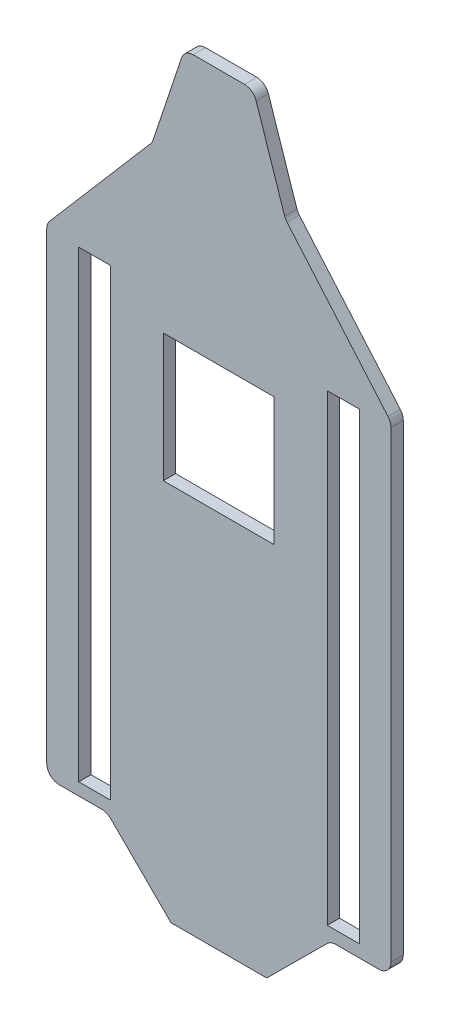
ISO-10303-21;
HEADER;
FILE_DESCRIPTION(('STEP AP214'),'2;1');
FILE_NAME('part.step','',(''),(''),'','','');
FILE_SCHEMA(('AUTOMOTIVE_DESIGN { 1 0 10303 214 1 1 1 1 }'));
ENDSEC;
DATA;
#1=APPLICATION_CONTEXT('core data for automotive mechanical design processes');
#2=APPLICATION_PROTOCOL_DEFINITION('international standard','automotive_design',2000,#1);
#3=PRODUCT_CONTEXT('',#1,'mechanical');
#4=PRODUCT('Part','Part','',(#3));
#5=PRODUCT_RELATED_PRODUCT_CATEGORY('part','',(#4));
#6=PRODUCT_DEFINITION_FORMATION('','',#4);
#7=PRODUCT_DEFINITION_CONTEXT('part definition',#1,'design');
#8=PRODUCT_DEFINITION('design','',#6,#7);
#9=PRODUCT_DEFINITION_SHAPE('','',#8);
#10=(LENGTH_UNIT() NAMED_UNIT(*) SI_UNIT(.MILLI.,.METRE.));
#11=(NAMED_UNIT(*) PLANE_ANGLE_UNIT() SI_UNIT($,.RADIAN.));
#12=(NAMED_UNIT(*) SI_UNIT($,.STERADIAN.) SOLID_ANGLE_UNIT());
#13=UNCERTAINTY_MEASURE_WITH_UNIT(LENGTH_MEASURE(1.E-05),#10,'distance_accuracy_value','');
#14=(GEOMETRIC_REPRESENTATION_CONTEXT(3) GLOBAL_UNCERTAINTY_ASSIGNED_CONTEXT((#13)) GLOBAL_UNIT_ASSIGNED_CONTEXT((#10,
#11,#12)) REPRESENTATION_CONTEXT('',''));
#15=CARTESIAN_POINT('',(0.,0.,0.));
#16=DIRECTION('',(0.,0.,1.));
#17=DIRECTION('',(1.,0.,0.));
#18=AXIS2_PLACEMENT_3D('',#15,#16,#17);
#19=CARTESIAN_POINT('',(22.4368378443237,20.8599431741363,5.));
#20=DIRECTION('',(0.,0.,-1.));
#21=DIRECTION('',(-1.,0.,0.));
#22=AXIS2_PLACEMENT_3D('',#19,#20,#21);
#23=PLANE('',#22);
#24=DIRECTION('',(0.,1.,0.));
#25=VECTOR('',#24,1.);
#26=CARTESIAN_POINT('',(127.,219.008918922933,5.));
#27=LINE('',#26,#25);
#28=CARTESIAN_POINT('',(127.,30.8599431741363,5.));
#29=VERTEX_POINT('',#28);
#30=CARTESIAN_POINT('',(127.,219.008918922933,5.));
#31=VERTEX_POINT('',#30);
#32=EDGE_CURVE('E294',#29,#31,#27,.T.);
#33=ORIENTED_EDGE('',*,*,#32,.F.);
#34=DIRECTION('',(1.,0.,0.));
#35=VECTOR('',#34,1.);
#36=CARTESIAN_POINT('',(127.,30.8599431741363,5.));
#37=LINE('',#36,#35);
#38=CARTESIAN_POINT('',(114.,30.8599431741363,5.));
#39=VERTEX_POINT('',#38);
#40=EDGE_CURVE('E302',#39,#29,#37,.T.);
#41=ORIENTED_EDGE('',*,*,#40,.F.);
#42=DIRECTION('',(0.,-1.,0.));
#43=VECTOR('',#42,1.);
#44=CARTESIAN_POINT('',(114.,30.8599431741363,5.));
#45=LINE('',#44,#43);
#46=CARTESIAN_POINT('',(114.,219.008918922933,5.));
#47=VERTEX_POINT('',#46);
#48=EDGE_CURVE('E299',#47,#39,#45,.T.);
#49=ORIENTED_EDGE('',*,*,#48,.F.);
#50=DIRECTION('',(-1.,0.,0.));
#51=VECTOR('',#50,1.);
#52=CARTESIAN_POINT('',(114.,219.008918922933,5.));
#53=LINE('',#52,#51);
#54=EDGE_CURVE('E296',#31,#47,#53,.T.);
#55=ORIENTED_EDGE('',*,*,#54,.F.);
#56=EDGE_LOOP('',(#33,#41,#49,#55));
#57=FACE_BOUND('',#56,.T.);
#58=DIRECTION('',(1.,0.,0.));
#59=VECTOR('',#58,1.);
#60=CARTESIAN_POINT('',(89.3828592898621,0.,5.));
#61=LINE('',#60,#59);
#62=CARTESIAN_POINT('',(50.5,0.,5.));
#63=VERTEX_POINT('',#62);
#64=CARTESIAN_POINT('',(89.3828592898621,0.,5.));
#65=VERTEX_POINT('',#64);
#66=EDGE_CURVE('E356',#63,#65,#61,.T.);
#67=ORIENTED_EDGE('',*,*,#66,.T.);
#68=DIRECTION('',(0.709013860793847,0.705194544223226,0.));
#69=VECTOR('',#68,1.);
#70=CARTESIAN_POINT('',(113.920048724422,24.4050124781055,5.));
#71=LINE('',#70,#69);
#72=CARTESIAN_POINT('',(113.920048724422,24.4050124781055,5.));
#73=VERTEX_POINT('',#72);
#74=EDGE_CURVE('E359',#65,#73,#71,.T.);
#75=ORIENTED_EDGE('',*,*,#74,.T.);
#76=CARTESIAN_POINT('',(117.446021445538,20.8599431741363,5.));
#77=DIRECTION('',(0.,0.,-1.));
#78=DIRECTION('',(1.,0.,0.));
#79=AXIS2_PLACEMENT_3D('',#76,#77,#78);
#80=CIRCLE('',#79,5.);
#81=CARTESIAN_POINT('',(117.446021445538,25.8599431741363,5.));
#82=VERTEX_POINT('',#81);
#83=EDGE_CURVE('E362',#73,#82,#80,.T.);
#84=ORIENTED_EDGE('',*,*,#83,.T.);
#85=DIRECTION('',(1.,0.,0.));
#86=VECTOR('',#85,1.);
#87=CARTESIAN_POINT('',(134.882859289862,25.8599431741363,5.));
#88=LINE('',#87,#86);
#89=CARTESIAN_POINT('',(134.882859289862,25.8599431741363,5.));
#90=VERTEX_POINT('',#89);
#91=EDGE_CURVE('E364',#82,#90,#88,.T.);
#92=ORIENTED_EDGE('',*,*,#91,.T.);
#93=CARTESIAN_POINT('',(134.882859289862,30.8599431741363,5.));
#94=DIRECTION('',(0.,0.,1.));
#95=DIRECTION('',(1.,0.,0.));
#96=AXIS2_PLACEMENT_3D('',#93,#94,#95);
#97=CIRCLE('',#96,5.);
#98=CARTESIAN_POINT('',(139.882859289862,30.8599431741363,5.));
#99=VERTEX_POINT('',#98);
#100=EDGE_CURVE('E366',#90,#99,#97,.T.);
#101=ORIENTED_EDGE('',*,*,#100,.T.);
#102=DIRECTION('',(0.,1.,0.));
#103=VECTOR('',#102,1.);
#104=CARTESIAN_POINT('',(139.882859289862,30.8599431741363,5.));
#105=LINE('',#104,#103);
#106=CARTESIAN_POINT('',(139.882859289862,219.008918922933,5.));
#107=VERTEX_POINT('',#106);
#108=EDGE_CURVE('E368',#99,#107,#105,.T.);
#109=ORIENTED_EDGE('',*,*,#108,.T.);
#110=CARTESIAN_POINT('',(134.882859289862,219.008918922933,5.));
#111=DIRECTION('',(0.,0.,1.));
#112=DIRECTION('',(1.,0.,0.));
#113=AXIS2_PLACEMENT_3D('',#110,#111,#112);
#114=CIRCLE('',#113,5.00000000000001);
#115=CARTESIAN_POINT('',(138.677534682009,222.264750409395,5.));
#116=VERTEX_POINT('',#115);
#117=EDGE_CURVE('E370',#107,#116,#114,.T.);
#118=ORIENTED_EDGE('',*,*,#117,.T.);
#119=DIRECTION('',(-0.651166297292376,0.758935078429333,0.));
#120=VECTOR('',#119,1.);
#121=CARTESIAN_POINT('',(97.621470018801,270.115641625254,5.));
#122=LINE('',#121,#120);
#123=CARTESIAN_POINT('',(97.621470018801,270.115641625254,5.));
#124=VERTEX_POINT('',#123);
#125=EDGE_CURVE('E372',#116,#124,#122,.T.);
#126=ORIENTED_EDGE('',*,*,#125,.T.);
#127=CARTESIAN_POINT('',(101.416145410948,273.371473111716,5.));
#128=DIRECTION('',(0.,0.,-1.));
#129=DIRECTION('',(-1.,0.,0.));
#130=AXIS2_PLACEMENT_3D('',#127,#128,#129);
#131=CIRCLE('',#130,4.99999999999998);
#132=CARTESIAN_POINT('',(96.6727289206954,271.790334281631,5.));
#133=VERTEX_POINT('',#132);
#134=EDGE_CURVE('E374',#124,#133,#131,.T.);
#135=ORIENTED_EDGE('',*,*,#134,.T.);
#136=DIRECTION('',(-0.316227766017022,0.948683298050452,0.));
#137=VECTOR('',#136,1.);
#138=CARTESIAN_POINT('',(85.0804626320662,306.567133147496,5.));
#139=LINE('',#138,#137);
#140=CARTESIAN_POINT('',(85.0804626320662,306.567133147496,5.));
#141=VERTEX_POINT('',#140);
#142=EDGE_CURVE('E376',#133,#141,#139,.T.);
#143=ORIENTED_EDGE('',*,*,#142,.T.);
#144=CARTESIAN_POINT('',(80.3370461418139,304.985994317411,5.));
#145=DIRECTION('',(0.,0.,1.));
#146=DIRECTION('',(1.,0.,0.));
#147=AXIS2_PLACEMENT_3D('',#144,#145,#146);
#148=CIRCLE('',#147,5.00000000000002);
#149=CARTESIAN_POINT('',(80.3789443517646,309.985818768329,5.));
#150=VERTEX_POINT('',#149);
#151=EDGE_CURVE('E378',#141,#150,#148,.T.);
#152=ORIENTED_EDGE('',*,*,#151,.T.);
#153=DIRECTION('',(-1.,0.,0.));
#154=VECTOR('',#153,1.);
#155=CARTESIAN_POINT('',(59.5039149380974,309.985818768329,5.));
#156=LINE('',#155,#154);
#157=CARTESIAN_POINT('',(59.5039149380974,309.985818768329,5.));
#158=VERTEX_POINT('',#157);
#159=EDGE_CURVE('E380',#150,#158,#156,.T.);
#160=ORIENTED_EDGE('',*,*,#159,.T.);
#161=CARTESIAN_POINT('',(59.545813148048,304.985994317411,5.));
#162=DIRECTION('',(0.,0.,1.));
#163=DIRECTION('',(-1.,0.,0.));
#164=AXIS2_PLACEMENT_3D('',#161,#162,#163);
#165=CIRCLE('',#164,5.00000000000002);
#166=CARTESIAN_POINT('',(54.8023966577958,306.567133147496,5.));
#167=VERTEX_POINT('',#166);
#168=EDGE_CURVE('E382',#158,#167,#165,.T.);
#169=ORIENTED_EDGE('',*,*,#168,.T.);
#170=DIRECTION('',(-0.316227766017022,-0.948683298050452,0.));
#171=VECTOR('',#170,1.);
#172=CARTESIAN_POINT('',(54.8023966577958,306.567133147496,5.));
#173=LINE('',#172,#171);
#174=CARTESIAN_POINT('',(43.2101303691666,271.790334281631,5.));
#175=VERTEX_POINT('',#174);
#176=EDGE_CURVE('E384',#167,#175,#173,.T.);
#177=ORIENTED_EDGE('',*,*,#176,.T.);
#178=CARTESIAN_POINT('',(38.4667138789144,273.371473111716,5.));
#179=DIRECTION('',(0.,0.,-1.));
#180=DIRECTION('',(1.,0.,0.));
#181=AXIS2_PLACEMENT_3D('',#178,#179,#180);
#182=CIRCLE('',#181,4.99999999999997);
#183=CARTESIAN_POINT('',(42.261389271061,270.115641625254,5.));
#184=VERTEX_POINT('',#183);
#185=EDGE_CURVE('E386',#175,#184,#182,.T.);
#186=ORIENTED_EDGE('',*,*,#185,.T.);
#187=DIRECTION('',(-0.651166297292376,-0.758935078429333,0.));
#188=VECTOR('',#187,1.);
#189=CARTESIAN_POINT('',(42.261389271061,270.115641625254,5.));
#190=LINE('',#189,#188);
#191=CARTESIAN_POINT('',(1.20532460785331,222.264750409395,5.));
#192=VERTEX_POINT('',#191);
#193=EDGE_CURVE('E388',#184,#192,#190,.T.);
#194=ORIENTED_EDGE('',*,*,#193,.T.);
#195=CARTESIAN_POINT('',(4.99999999999998,219.008918922933,5.));
#196=DIRECTION('',(0.,0.,1.));
#197=DIRECTION('',(-1.,0.,0.));
#198=AXIS2_PLACEMENT_3D('',#195,#196,#197);
#199=CIRCLE('',#198,5.00000000000001);
#200=CARTESIAN_POINT('',(0.,219.008918922933,5.));
#201=VERTEX_POINT('',#200);
#202=EDGE_CURVE('E390',#192,#201,#199,.T.);
#203=ORIENTED_EDGE('',*,*,#202,.T.);
#204=DIRECTION('',(0.,-1.,0.));
#205=VECTOR('',#204,1.);
#206=CARTESIAN_POINT('',(0.,30.8599431741363,5.));
#207=LINE('',#206,#205);
#208=CARTESIAN_POINT('',(0.,30.8599431741363,5.));
#209=VERTEX_POINT('',#208);
#210=EDGE_CURVE('E392',#201,#209,#207,.T.);
#211=ORIENTED_EDGE('',*,*,#210,.T.);
#212=CARTESIAN_POINT('',(5.00000000000002,30.8599431741363,5.));
#213=DIRECTION('',(0.,0.,1.));
#214=DIRECTION('',(-1.,0.,0.));
#215=AXIS2_PLACEMENT_3D('',#212,#213,#214);
#216=CIRCLE('',#215,5.);
#217=CARTESIAN_POINT('',(5.00000000000006,25.8599431741363,5.));
#218=VERTEX_POINT('',#217);
#219=EDGE_CURVE('E394',#209,#218,#216,.T.);
#220=ORIENTED_EDGE('',*,*,#219,.T.);
#221=DIRECTION('',(1.,0.,0.));
#222=VECTOR('',#221,1.);
#223=CARTESIAN_POINT('',(5.00000000000006,25.8599431741363,5.));
#224=LINE('',#223,#222);
#225=CARTESIAN_POINT('',(22.4368378443237,25.8599431741363,5.));
#226=VERTEX_POINT('',#225);
#227=EDGE_CURVE('E396',#218,#226,#224,.T.);
#228=ORIENTED_EDGE('',*,*,#227,.T.);
#229=CARTESIAN_POINT('',(22.4368378443237,20.8599431741363,5.));
#230=DIRECTION('',(0.,0.,-1.));
#231=DIRECTION('',(-1.,0.,0.));
#232=AXIS2_PLACEMENT_3D('',#229,#230,#231);
#233=CIRCLE('',#232,5.);
#234=CARTESIAN_POINT('',(25.9628105654398,24.4050124781055,5.));
#235=VERTEX_POINT('',#234);
#236=EDGE_CURVE('E398',#226,#235,#233,.T.);
#237=ORIENTED_EDGE('',*,*,#236,.T.);
#238=DIRECTION('',(0.709013860793847,-0.705194544223226,0.));
#239=VECTOR('',#238,1.);
#240=CARTESIAN_POINT('',(25.9628105654398,24.4050124781055,5.));
#241=LINE('',#240,#239);
#242=EDGE_CURVE('E400',#235,#63,#241,.T.);
#243=ORIENTED_EDGE('',*,*,#242,.T.);
#244=EDGE_LOOP('',(#67,#75,#84,#92,#101,#109,#118,#126,#135,#143,#152,#160,#169,#177,#186,#194,
#203,#211,#220,#228,#237,#243));
#245=FACE_BOUND('',#244,.T.);
#246=DIRECTION('',(1.,0.,0.));
#247=VECTOR('',#246,1.);
#248=CARTESIAN_POINT('',(13.,30.8599431741363,5.));
#249=LINE('',#248,#247);
#250=CARTESIAN_POINT('',(13.,30.8599431741363,5.));
#251=VERTEX_POINT('',#250);
#252=CARTESIAN_POINT('',(26.,30.8599431741363,5.));
#253=VERTEX_POINT('',#252);
#254=EDGE_CURVE('E325',#251,#253,#249,.T.);
#255=ORIENTED_EDGE('',*,*,#254,.F.);
#256=DIRECTION('',(0.,-1.,0.));
#257=VECTOR('',#256,1.);
#258=CARTESIAN_POINT('',(13.,219.008918922933,5.));
#259=LINE('',#258,#257);
#260=CARTESIAN_POINT('',(13.,219.008918922933,5.));
#261=VERTEX_POINT('',#260);
#262=EDGE_CURVE('E333',#261,#251,#259,.T.);
#263=ORIENTED_EDGE('',*,*,#262,.F.);
#264=DIRECTION('',(-1.,0.,0.));
#265=VECTOR('',#264,1.);
#266=CARTESIAN_POINT('',(26.,219.008918922933,5.));
#267=LINE('',#266,#265);
#268=CARTESIAN_POINT('',(26.,219.008918922933,5.));
#269=VERTEX_POINT('',#268);
#270=EDGE_CURVE('E330',#269,#261,#267,.T.);
#271=ORIENTED_EDGE('',*,*,#270,.F.);
#272=DIRECTION('',(0.,1.,0.));
#273=VECTOR('',#272,1.);
#274=CARTESIAN_POINT('',(26.,30.8599431741363,5.));
#275=LINE('',#274,#273);
#276=EDGE_CURVE('E327',#253,#269,#275,.T.);
#277=ORIENTED_EDGE('',*,*,#276,.F.);
#278=EDGE_LOOP('',(#255,#263,#271,#277));
#279=FACE_BOUND('',#278,.T.);
#280=DIRECTION('',(0.,-1.,0.));
#281=VECTOR('',#280,1.);
#282=CARTESIAN_POINT('',(92.382859289862,0.,5.));
#283=LINE('',#282,#281);
#284=CARTESIAN_POINT('',(92.382859289862,206.008918922933,5.));
#285=VERTEX_POINT('',#284);
#286=CARTESIAN_POINT('',(92.382859289862,154.008918922933,5.));
#287=VERTEX_POINT('',#286);
#288=EDGE_CURVE('E52',#285,#287,#283,.T.);
#289=ORIENTED_EDGE('',*,*,#288,.T.);
#290=DIRECTION('',(1.,0.,0.));
#291=VECTOR('',#290,1.);
#292=CARTESIAN_POINT('',(0.,154.008918922933,5.));
#293=LINE('',#292,#291);
#294=CARTESIAN_POINT('',(47.3828592898621,154.008918922933,5.));
#295=VERTEX_POINT('',#294);
#296=EDGE_CURVE('E275',#295,#287,#293,.T.);
#297=ORIENTED_EDGE('',*,*,#296,.F.);
#298=DIRECTION('',(0.,-1.,0.));
#299=VECTOR('',#298,1.);
#300=CARTESIAN_POINT('',(47.3828592898621,0.,5.));
#301=LINE('',#300,#299);
#302=CARTESIAN_POINT('',(47.382859289862,206.008918922933,5.));
#303=VERTEX_POINT('',#302);
#304=EDGE_CURVE('E278',#303,#295,#301,.T.);
#305=ORIENTED_EDGE('',*,*,#304,.F.);
#306=DIRECTION('',(-1.,0.,0.));
#307=VECTOR('',#306,1.);
#308=CARTESIAN_POINT('',(0.,206.008918922933,5.));
#309=LINE('',#308,#307);
#310=EDGE_CURVE('E284',#285,#303,#309,.T.);
#311=ORIENTED_EDGE('',*,*,#310,.F.);
#312=EDGE_LOOP('',(#289,#297,#305,#311));
#313=FACE_BOUND('',#312,.T.);
#314=ADVANCED_FACE('F37',(#57,#245,#279,#313),#23,.F.);
#315=CARTESIAN_POINT('',(22.4368378443237,20.8599431741363,0.));
#316=DIRECTION('',(0.,0.,-1.));
#317=DIRECTION('',(-1.,0.,0.));
#318=AXIS2_PLACEMENT_3D('',#315,#316,#317);
#319=PLANE('',#318);
#320=DIRECTION('',(1.,0.,0.));
#321=VECTOR('',#320,1.);
#322=CARTESIAN_POINT('',(89.3828592898621,0.,0.));
#323=LINE('',#322,#321);
#324=CARTESIAN_POINT('',(50.5,0.,0.));
#325=VERTEX_POINT('',#324);
#326=CARTESIAN_POINT('',(89.3828592898621,0.,0.));
#327=VERTEX_POINT('',#326);
#328=EDGE_CURVE('E355',#325,#327,#323,.T.);
#329=ORIENTED_EDGE('',*,*,#328,.F.);
#330=DIRECTION('',(0.709013860793847,-0.705194544223226,0.));
#331=VECTOR('',#330,1.);
#332=CARTESIAN_POINT('',(25.9628105654398,24.4050124781055,0.));
#333=LINE('',#332,#331);
#334=CARTESIAN_POINT('',(25.9628105654398,24.4050124781055,0.));
#335=VERTEX_POINT('',#334);
#336=EDGE_CURVE('E360',#335,#325,#333,.T.);
#337=ORIENTED_EDGE('',*,*,#336,.F.);
#338=CARTESIAN_POINT('',(22.4368378443237,20.8599431741363,0.));
#339=DIRECTION('',(0.,0.,-1.));
#340=DIRECTION('',(-1.,0.,0.));
#341=AXIS2_PLACEMENT_3D('',#338,#339,#340);
#342=CIRCLE('',#341,5.);
#343=CARTESIAN_POINT('',(22.4368378443237,25.8599431741363,0.));
#344=VERTEX_POINT('',#343);
#345=EDGE_CURVE('E443',#344,#335,#342,.T.);
#346=ORIENTED_EDGE('',*,*,#345,.F.);
#347=DIRECTION('',(1.,0.,0.));
#348=VECTOR('',#347,1.);
#349=CARTESIAN_POINT('',(5.00000000000006,25.8599431741363,0.));
#350=LINE('',#349,#348);
#351=CARTESIAN_POINT('',(5.00000000000006,25.8599431741363,0.));
#352=VERTEX_POINT('',#351);
#353=EDGE_CURVE('E441',#352,#344,#350,.T.);
#354=ORIENTED_EDGE('',*,*,#353,.F.);
#355=CARTESIAN_POINT('',(5.00000000000002,30.8599431741363,0.));
#356=DIRECTION('',(0.,0.,1.));
#357=DIRECTION('',(-1.,0.,0.));
#358=AXIS2_PLACEMENT_3D('',#355,#356,#357);
#359=CIRCLE('',#358,5.);
#360=CARTESIAN_POINT('',(0.,30.8599431741363,0.));
#361=VERTEX_POINT('',#360);
#362=EDGE_CURVE('E439',#361,#352,#359,.T.);
#363=ORIENTED_EDGE('',*,*,#362,.F.);
#364=DIRECTION('',(0.,-1.,0.));
#365=VECTOR('',#364,1.);
#366=CARTESIAN_POINT('',(0.,30.8599431741363,0.));
#367=LINE('',#366,#365);
#368=CARTESIAN_POINT('',(0.,219.008918922933,0.));
#369=VERTEX_POINT('',#368);
#370=EDGE_CURVE('E437',#369,#361,#367,.T.);
#371=ORIENTED_EDGE('',*,*,#370,.F.);
#372=CARTESIAN_POINT('',(4.99999999999998,219.008918922933,0.));
#373=DIRECTION('',(0.,0.,1.));
#374=DIRECTION('',(-1.,0.,0.));
#375=AXIS2_PLACEMENT_3D('',#372,#373,#374);
#376=CIRCLE('',#375,5.00000000000001);
#377=CARTESIAN_POINT('',(1.20532460785331,222.264750409395,0.));
#378=VERTEX_POINT('',#377);
#379=EDGE_CURVE('E435',#378,#369,#376,.T.);
#380=ORIENTED_EDGE('',*,*,#379,.F.);
#381=DIRECTION('',(-0.651166297292376,-0.758935078429333,0.));
#382=VECTOR('',#381,1.);
#383=CARTESIAN_POINT('',(42.261389271061,270.115641625254,0.));
#384=LINE('',#383,#382);
#385=CARTESIAN_POINT('',(42.261389271061,270.115641625254,0.));
#386=VERTEX_POINT('',#385);
#387=EDGE_CURVE('E433',#386,#378,#384,.T.);
#388=ORIENTED_EDGE('',*,*,#387,.F.);
#389=CARTESIAN_POINT('',(38.4667138789144,273.371473111716,0.));
#390=DIRECTION('',(0.,0.,-1.));
#391=DIRECTION('',(1.,0.,0.));
#392=AXIS2_PLACEMENT_3D('',#389,#390,#391);
#393=CIRCLE('',#392,4.99999999999997);
#394=CARTESIAN_POINT('',(43.2101303691666,271.790334281631,0.));
#395=VERTEX_POINT('',#394);
#396=EDGE_CURVE('E431',#395,#386,#393,.T.);
#397=ORIENTED_EDGE('',*,*,#396,.F.);
#398=DIRECTION('',(-0.316227766017022,-0.948683298050452,0.));
#399=VECTOR('',#398,1.);
#400=CARTESIAN_POINT('',(54.8023966577958,306.567133147496,0.));
#401=LINE('',#400,#399);
#402=CARTESIAN_POINT('',(54.8023966577958,306.567133147496,0.));
#403=VERTEX_POINT('',#402);
#404=EDGE_CURVE('E429',#403,#395,#401,.T.);
#405=ORIENTED_EDGE('',*,*,#404,.F.);
#406=CARTESIAN_POINT('',(59.545813148048,304.985994317411,0.));
#407=DIRECTION('',(0.,0.,1.));
#408=DIRECTION('',(-1.,0.,0.));
#409=AXIS2_PLACEMENT_3D('',#406,#407,#408);
#410=CIRCLE('',#409,5.00000000000002);
#411=CARTESIAN_POINT('',(59.5039149380974,309.985818768329,0.));
#412=VERTEX_POINT('',#411);
#413=EDGE_CURVE('E427',#412,#403,#410,.T.);
#414=ORIENTED_EDGE('',*,*,#413,.F.);
#415=DIRECTION('',(-1.,0.,0.));
#416=VECTOR('',#415,1.);
#417=CARTESIAN_POINT('',(59.5039149380974,309.985818768329,0.));
#418=LINE('',#417,#416);
#419=CARTESIAN_POINT('',(80.3789443517646,309.985818768329,0.));
#420=VERTEX_POINT('',#419);
#421=EDGE_CURVE('E425',#420,#412,#418,.T.);
#422=ORIENTED_EDGE('',*,*,#421,.F.);
#423=CARTESIAN_POINT('',(80.3370461418139,304.985994317411,0.));
#424=DIRECTION('',(0.,0.,1.));
#425=DIRECTION('',(1.,0.,0.));
#426=AXIS2_PLACEMENT_3D('',#423,#424,#425);
#427=CIRCLE('',#426,5.00000000000002);
#428=CARTESIAN_POINT('',(85.0804626320662,306.567133147496,0.));
#429=VERTEX_POINT('',#428);
#430=EDGE_CURVE('E423',#429,#420,#427,.T.);
#431=ORIENTED_EDGE('',*,*,#430,.F.);
#432=DIRECTION('',(-0.316227766017022,0.948683298050452,0.));
#433=VECTOR('',#432,1.);
#434=CARTESIAN_POINT('',(85.0804626320662,306.567133147496,0.));
#435=LINE('',#434,#433);
#436=CARTESIAN_POINT('',(96.6727289206954,271.790334281631,0.));
#437=VERTEX_POINT('',#436);
#438=EDGE_CURVE('E421',#437,#429,#435,.T.);
#439=ORIENTED_EDGE('',*,*,#438,.F.);
#440=CARTESIAN_POINT('',(101.416145410948,273.371473111716,0.));
#441=DIRECTION('',(0.,0.,-1.));
#442=DIRECTION('',(-1.,0.,0.));
#443=AXIS2_PLACEMENT_3D('',#440,#441,#442);
#444=CIRCLE('',#443,4.99999999999998);
#445=CARTESIAN_POINT('',(97.621470018801,270.115641625254,0.));
#446=VERTEX_POINT('',#445);
#447=EDGE_CURVE('E419',#446,#437,#444,.T.);
#448=ORIENTED_EDGE('',*,*,#447,.F.);
#449=DIRECTION('',(-0.651166297292376,0.758935078429333,0.));
#450=VECTOR('',#449,1.);
#451=CARTESIAN_POINT('',(97.621470018801,270.115641625254,0.));
#452=LINE('',#451,#450);
#453=CARTESIAN_POINT('',(138.677534682009,222.264750409395,0.));
#454=VERTEX_POINT('',#453);
#455=EDGE_CURVE('E417',#454,#446,#452,.T.);
#456=ORIENTED_EDGE('',*,*,#455,.F.);
#457=CARTESIAN_POINT('',(134.882859289862,219.008918922933,0.));
#458=DIRECTION('',(0.,0.,1.));
#459=DIRECTION('',(1.,0.,0.));
#460=AXIS2_PLACEMENT_3D('',#457,#458,#459);
#461=CIRCLE('',#460,5.00000000000001);
#462=CARTESIAN_POINT('',(139.882859289862,219.008918922933,0.));
#463=VERTEX_POINT('',#462);
#464=EDGE_CURVE('E415',#463,#454,#461,.T.);
#465=ORIENTED_EDGE('',*,*,#464,.F.);
#466=DIRECTION('',(0.,1.,0.));
#467=VECTOR('',#466,1.);
#468=CARTESIAN_POINT('',(139.882859289862,30.8599431741363,0.));
#469=LINE('',#468,#467);
#470=CARTESIAN_POINT('',(139.882859289862,30.8599431741363,0.));
#471=VERTEX_POINT('',#470);
#472=EDGE_CURVE('E413',#471,#463,#469,.T.);
#473=ORIENTED_EDGE('',*,*,#472,.F.);
#474=CARTESIAN_POINT('',(134.882859289862,30.8599431741363,0.));
#475=DIRECTION('',(0.,0.,1.));
#476=DIRECTION('',(1.,0.,0.));
#477=AXIS2_PLACEMENT_3D('',#474,#475,#476);
#478=CIRCLE('',#477,5.);
#479=CARTESIAN_POINT('',(134.882859289862,25.8599431741363,0.));
#480=VERTEX_POINT('',#479);
#481=EDGE_CURVE('E411',#480,#471,#478,.T.);
#482=ORIENTED_EDGE('',*,*,#481,.F.);
#483=DIRECTION('',(1.,0.,0.));
#484=VECTOR('',#483,1.);
#485=CARTESIAN_POINT('',(134.882859289862,25.8599431741363,0.));
#486=LINE('',#485,#484);
#487=CARTESIAN_POINT('',(117.446021445538,25.8599431741363,0.));
#488=VERTEX_POINT('',#487);
#489=EDGE_CURVE('E409',#488,#480,#486,.T.);
#490=ORIENTED_EDGE('',*,*,#489,.F.);
#491=CARTESIAN_POINT('',(117.446021445538,20.8599431741363,0.));
#492=DIRECTION('',(0.,0.,-1.));
#493=DIRECTION('',(1.,0.,0.));
#494=AXIS2_PLACEMENT_3D('',#491,#492,#493);
#495=CIRCLE('',#494,5.);
#496=CARTESIAN_POINT('',(113.920048724422,24.4050124781055,0.));
#497=VERTEX_POINT('',#496);
#498=EDGE_CURVE('E407',#497,#488,#495,.T.);
#499=ORIENTED_EDGE('',*,*,#498,.F.);
#500=DIRECTION('',(0.709013860793847,0.705194544223226,0.));
#501=VECTOR('',#500,1.);
#502=CARTESIAN_POINT('',(113.920048724422,24.4050124781055,0.));
#503=LINE('',#502,#501);
#504=EDGE_CURVE('E405',#327,#497,#503,.T.);
#505=ORIENTED_EDGE('',*,*,#504,.F.);
#506=EDGE_LOOP('',(#329,#337,#346,#354,#363,#371,#380,#388,#397,#405,#414,#422,#431,#439,#448,
#456,#465,#473,#482,#490,#499,#505));
#507=FACE_BOUND('',#506,.T.);
#508=DIRECTION('',(0.,-1.,0.));
#509=VECTOR('',#508,1.);
#510=CARTESIAN_POINT('',(13.,219.008918922933,0.));
#511=LINE('',#510,#509);
#512=CARTESIAN_POINT('',(13.,219.008918922933,0.));
#513=VERTEX_POINT('',#512);
#514=CARTESIAN_POINT('',(13.,30.8599431741363,0.));
#515=VERTEX_POINT('',#514);
#516=EDGE_CURVE('E328',#513,#515,#511,.T.);
#517=ORIENTED_EDGE('',*,*,#516,.T.);
#518=DIRECTION('',(1.,0.,0.));
#519=VECTOR('',#518,1.);
#520=CARTESIAN_POINT('',(13.,30.8599431741363,0.));
#521=LINE('',#520,#519);
#522=CARTESIAN_POINT('',(26.,30.8599431741363,0.));
#523=VERTEX_POINT('',#522);
#524=EDGE_CURVE('E324',#515,#523,#521,.T.);
#525=ORIENTED_EDGE('',*,*,#524,.T.);
#526=DIRECTION('',(0.,1.,0.));
#527=VECTOR('',#526,1.);
#528=CARTESIAN_POINT('',(26.,30.8599431741363,0.));
#529=LINE('',#528,#527);
#530=CARTESIAN_POINT('',(26.,219.008918922933,0.));
#531=VERTEX_POINT('',#530);
#532=EDGE_CURVE('E338',#523,#531,#529,.T.);
#533=ORIENTED_EDGE('',*,*,#532,.T.);
#534=DIRECTION('',(-1.,0.,0.));
#535=VECTOR('',#534,1.);
#536=CARTESIAN_POINT('',(26.,219.008918922933,0.));
#537=LINE('',#536,#535);
#538=EDGE_CURVE('E341',#531,#513,#537,.T.);
#539=ORIENTED_EDGE('',*,*,#538,.T.);
#540=EDGE_LOOP('',(#517,#525,#533,#539));
#541=FACE_BOUND('',#540,.T.);
#542=DIRECTION('',(1.,0.,0.));
#543=VECTOR('',#542,1.);
#544=CARTESIAN_POINT('',(127.,30.8599431741363,0.));
#545=LINE('',#544,#543);
#546=CARTESIAN_POINT('',(114.,30.8599431741363,0.));
#547=VERTEX_POINT('',#546);
#548=CARTESIAN_POINT('',(127.,30.8599431741363,0.));
#549=VERTEX_POINT('',#548);
#550=EDGE_CURVE('E297',#547,#549,#545,.T.);
#551=ORIENTED_EDGE('',*,*,#550,.T.);
#552=DIRECTION('',(0.,1.,0.));
#553=VECTOR('',#552,1.);
#554=CARTESIAN_POINT('',(127.,219.008918922933,0.));
#555=LINE('',#554,#553);
#556=CARTESIAN_POINT('',(127.,219.008918922933,0.));
#557=VERTEX_POINT('',#556);
#558=EDGE_CURVE('E290',#549,#557,#555,.T.);
#559=ORIENTED_EDGE('',*,*,#558,.T.);
#560=DIRECTION('',(-1.,0.,0.));
#561=VECTOR('',#560,1.);
#562=CARTESIAN_POINT('',(114.,219.008918922933,0.));
#563=LINE('',#562,#561);
#564=CARTESIAN_POINT('',(114.,219.008918922933,0.));
#565=VERTEX_POINT('',#564);
#566=EDGE_CURVE('E307',#557,#565,#563,.T.);
#567=ORIENTED_EDGE('',*,*,#566,.T.);
#568=DIRECTION('',(0.,-1.,0.));
#569=VECTOR('',#568,1.);
#570=CARTESIAN_POINT('',(114.,30.8599431741363,0.));
#571=LINE('',#570,#569);
#572=EDGE_CURVE('E310',#565,#547,#571,.T.);
#573=ORIENTED_EDGE('',*,*,#572,.T.);
#574=EDGE_LOOP('',(#551,#559,#567,#573));
#575=FACE_BOUND('',#574,.T.);
#576=DIRECTION('',(1.,0.,0.));
#577=VECTOR('',#576,1.);
#578=CARTESIAN_POINT('',(0.,154.008918922933,0.));
#579=LINE('',#578,#577);
#580=CARTESIAN_POINT('',(47.3828592898621,154.008918922933,0.));
#581=VERTEX_POINT('',#580);
#582=CARTESIAN_POINT('',(92.382859289862,154.008918922933,0.));
#583=VERTEX_POINT('',#582);
#584=EDGE_CURVE('E265',#581,#583,#579,.T.);
#585=ORIENTED_EDGE('',*,*,#584,.T.);
#586=DIRECTION('',(0.,-1.,0.));
#587=VECTOR('',#586,1.);
#588=CARTESIAN_POINT('',(92.382859289862,0.,0.));
#589=LINE('',#588,#587);
#590=CARTESIAN_POINT('',(92.382859289862,206.008918922933,0.));
#591=VERTEX_POINT('',#590);
#592=EDGE_CURVE('E259',#591,#583,#589,.T.);
#593=ORIENTED_EDGE('',*,*,#592,.F.);
#594=DIRECTION('',(-1.,0.,0.));
#595=VECTOR('',#594,1.);
#596=CARTESIAN_POINT('',(0.,206.008918922933,0.));
#597=LINE('',#596,#595);
#598=CARTESIAN_POINT('',(47.382859289862,206.008918922933,0.));
#599=VERTEX_POINT('',#598);
#600=EDGE_CURVE('E268',#591,#599,#597,.T.);
#601=ORIENTED_EDGE('',*,*,#600,.T.);
#602=DIRECTION('',(0.,-1.,0.));
#603=VECTOR('',#602,1.);
#604=CARTESIAN_POINT('',(47.3828592898621,0.,0.));
#605=LINE('',#604,#603);
#606=EDGE_CURVE('E60',#599,#581,#605,.T.);
#607=ORIENTED_EDGE('',*,*,#606,.T.);
#608=EDGE_LOOP('',(#585,#593,#601,#607));
#609=FACE_BOUND('',#608,.T.);
#610=ADVANCED_FACE('F273',(#507,#541,#575,#609),#319,.T.);
#611=CARTESIAN_POINT('',(89.3828592898621,0.,5.));
#612=DIRECTION('',(0.,1.,0.));
#613=DIRECTION('',(0.,0.,1.));
#614=AXIS2_PLACEMENT_3D('',#611,#612,#613);
#615=PLANE('',#614);
#616=ORIENTED_EDGE('',*,*,#328,.T.);
#617=DIRECTION('',(0.,0.,-1.));
#618=VECTOR('',#617,1.);
#619=CARTESIAN_POINT('',(89.3828592898621,0.,5.));
#620=LINE('',#619,#618);
#621=EDGE_CURVE('E11',#65,#327,#620,.T.);
#622=ORIENTED_EDGE('',*,*,#621,.F.);
#623=ORIENTED_EDGE('',*,*,#66,.F.);
#624=DIRECTION('',(0.,0.,-1.));
#625=VECTOR('',#624,1.);
#626=CARTESIAN_POINT('',(50.5,0.,5.));
#627=LINE('',#626,#625);
#628=EDGE_CURVE('E402',#63,#325,#627,.T.);
#629=ORIENTED_EDGE('',*,*,#628,.T.);
#630=EDGE_LOOP('',(#616,#622,#623,#629));
#631=FACE_BOUND('',#630,.T.);
#632=ADVANCED_FACE('F39',(#631),#615,.F.);
#633=CARTESIAN_POINT('',(113.920048724422,24.4050124781055,5.));
#634=DIRECTION('',(-0.705194544223226,0.709013860793847,0.));
#635=DIRECTION('',(-0.709013860793847,-0.705194544223226,0.));
#636=AXIS2_PLACEMENT_3D('',#633,#634,#635);
#637=PLANE('',#636);
#638=ORIENTED_EDGE('',*,*,#504,.T.);
#639=DIRECTION('',(0.,0.,-1.));
#640=VECTOR('',#639,1.);
#641=CARTESIAN_POINT('',(113.920048724422,24.4050124781055,5.));
#642=LINE('',#641,#640);
#643=EDGE_CURVE('E45',#73,#497,#642,.T.);
#644=ORIENTED_EDGE('',*,*,#643,.F.);
#645=ORIENTED_EDGE('',*,*,#74,.F.);
#646=ORIENTED_EDGE('',*,*,#621,.T.);
#647=EDGE_LOOP('',(#638,#644,#645,#646));
#648=FACE_BOUND('',#647,.T.);
#649=ADVANCED_FACE('F532',(#648),#637,.F.);
#650=CARTESIAN_POINT('',(117.446021445538,20.8599431741363,5.));
#651=DIRECTION('',(0.,0.,-1.));
#652=DIRECTION('',(-1.,0.,0.));
#653=AXIS2_PLACEMENT_3D('',#650,#651,#652);
#654=CYLINDRICAL_SURFACE('',#653,5.);
#655=ORIENTED_EDGE('',*,*,#498,.T.);
#656=DIRECTION('',(0.,0.,-1.));
#657=VECTOR('',#656,1.);
#658=CARTESIAN_POINT('',(117.446021445538,25.8599431741363,5.));
#659=LINE('',#658,#657);
#660=EDGE_CURVE('E502',#82,#488,#659,.T.);
#661=ORIENTED_EDGE('',*,*,#660,.F.);
#662=ORIENTED_EDGE('',*,*,#83,.F.);
#663=ORIENTED_EDGE('',*,*,#643,.T.);
#664=EDGE_LOOP('',(#655,#661,#662,#663));
#665=FACE_BOUND('',#664,.T.);
#666=ADVANCED_FACE('F509',(#665),#654,.F.);
#667=CARTESIAN_POINT('',(134.882859289862,25.8599431741363,5.));
#668=DIRECTION('',(0.,1.,0.));
#669=DIRECTION('',(0.,0.,1.));
#670=AXIS2_PLACEMENT_3D('',#667,#668,#669);
#671=PLANE('',#670);
#672=ORIENTED_EDGE('',*,*,#489,.T.);
#673=DIRECTION('',(0.,0.,-1.));
#674=VECTOR('',#673,1.);
#675=CARTESIAN_POINT('',(134.882859289862,25.8599431741363,5.));
#676=LINE('',#675,#674);
#677=EDGE_CURVE('E499',#90,#480,#676,.T.);
#678=ORIENTED_EDGE('',*,*,#677,.F.);
#679=ORIENTED_EDGE('',*,*,#91,.F.);
#680=ORIENTED_EDGE('',*,*,#660,.T.);
#681=EDGE_LOOP('',(#672,#678,#679,#680));
#682=FACE_BOUND('',#681,.T.);
#683=ADVANCED_FACE('F520',(#682),#671,.F.);
#684=CARTESIAN_POINT('',(134.882859289862,30.8599431741363,5.));
#685=DIRECTION('',(0.,0.,-1.));
#686=DIRECTION('',(-1.,0.,0.));
#687=AXIS2_PLACEMENT_3D('',#684,#685,#686);
#688=CYLINDRICAL_SURFACE('',#687,5.);
#689=ORIENTED_EDGE('',*,*,#481,.T.);
#690=DIRECTION('',(0.,0.,-1.));
#691=VECTOR('',#690,1.);
#692=CARTESIAN_POINT('',(139.882859289862,30.8599431741363,5.));
#693=LINE('',#692,#691);
#694=EDGE_CURVE('E496',#99,#471,#693,.T.);
#695=ORIENTED_EDGE('',*,*,#694,.F.);
#696=ORIENTED_EDGE('',*,*,#100,.F.);
#697=ORIENTED_EDGE('',*,*,#677,.T.);
#698=EDGE_LOOP('',(#689,#695,#696,#697));
#699=FACE_BOUND('',#698,.T.);
#700=ADVANCED_FACE('F524',(#699),#688,.T.);
#701=CARTESIAN_POINT('',(139.882859289862,30.8599431741363,5.));
#702=DIRECTION('',(-1.,0.,0.));
#703=DIRECTION('',(0.,0.,1.));
#704=AXIS2_PLACEMENT_3D('',#701,#702,#703);
#705=PLANE('',#704);
#706=ORIENTED_EDGE('',*,*,#472,.T.);
#707=DIRECTION('',(0.,0.,-1.));
#708=VECTOR('',#707,1.);
#709=CARTESIAN_POINT('',(139.882859289862,219.008918922933,5.));
#710=LINE('',#709,#708);
#711=EDGE_CURVE('E493',#107,#463,#710,.T.);
#712=ORIENTED_EDGE('',*,*,#711,.F.);
#713=ORIENTED_EDGE('',*,*,#108,.F.);
#714=ORIENTED_EDGE('',*,*,#694,.T.);
#715=EDGE_LOOP('',(#706,#712,#713,#714));
#716=FACE_BOUND('',#715,.T.);
#717=ADVANCED_FACE('F615',(#716),#705,.F.);
#718=CARTESIAN_POINT('',(134.882859289862,219.008918922933,5.));
#719=DIRECTION('',(0.,0.,-1.));
#720=DIRECTION('',(-1.,0.,0.));
#721=AXIS2_PLACEMENT_3D('',#718,#719,#720);
#722=CYLINDRICAL_SURFACE('',#721,5.00000000000001);
#723=ORIENTED_EDGE('',*,*,#464,.T.);
#724=DIRECTION('',(0.,0.,-1.));
#725=VECTOR('',#724,1.);
#726=CARTESIAN_POINT('',(138.677534682009,222.264750409395,5.));
#727=LINE('',#726,#725);
#728=EDGE_CURVE('E490',#116,#454,#727,.T.);
#729=ORIENTED_EDGE('',*,*,#728,.F.);
#730=ORIENTED_EDGE('',*,*,#117,.F.);
#731=ORIENTED_EDGE('',*,*,#711,.T.);
#732=EDGE_LOOP('',(#723,#729,#730,#731));
#733=FACE_BOUND('',#732,.T.);
#734=ADVANCED_FACE('F612',(#733),#722,.T.);
#735=CARTESIAN_POINT('',(97.621470018801,270.115641625254,5.));
#736=DIRECTION('',(-0.758935078429333,-0.651166297292376,0.));
#737=DIRECTION('',(0.651166297292376,-0.758935078429333,0.));
#738=AXIS2_PLACEMENT_3D('',#735,#736,#737);
#739=PLANE('',#738);
#740=ORIENTED_EDGE('',*,*,#455,.T.);
#741=DIRECTION('',(0.,0.,-1.));
#742=VECTOR('',#741,1.);
#743=CARTESIAN_POINT('',(97.621470018801,270.115641625254,5.));
#744=LINE('',#743,#742);
#745=EDGE_CURVE('E487',#124,#446,#744,.T.);
#746=ORIENTED_EDGE('',*,*,#745,.F.);
#747=ORIENTED_EDGE('',*,*,#125,.F.);
#748=ORIENTED_EDGE('',*,*,#728,.T.);
#749=EDGE_LOOP('',(#740,#746,#747,#748));
#750=FACE_BOUND('',#749,.T.);
#751=ADVANCED_FACE('F608',(#750),#739,.F.);
#752=CARTESIAN_POINT('',(101.416145410948,273.371473111716,5.));
#753=DIRECTION('',(0.,0.,-1.));
#754=DIRECTION('',(-1.,0.,0.));
#755=AXIS2_PLACEMENT_3D('',#752,#753,#754);
#756=CYLINDRICAL_SURFACE('',#755,4.99999999999998);
#757=ORIENTED_EDGE('',*,*,#447,.T.);
#758=DIRECTION('',(0.,0.,-1.));
#759=VECTOR('',#758,1.);
#760=CARTESIAN_POINT('',(96.6727289206954,271.790334281631,5.));
#761=LINE('',#760,#759);
#762=EDGE_CURVE('E484',#133,#437,#761,.T.);
#763=ORIENTED_EDGE('',*,*,#762,.F.);
#764=ORIENTED_EDGE('',*,*,#134,.F.);
#765=ORIENTED_EDGE('',*,*,#745,.T.);
#766=EDGE_LOOP('',(#757,#763,#764,#765));
#767=FACE_BOUND('',#766,.T.);
#768=ADVANCED_FACE('F604',(#767),#756,.F.);
#769=CARTESIAN_POINT('',(85.0804626320662,306.567133147496,5.));
#770=DIRECTION('',(-0.948683298050452,-0.316227766017022,0.));
#771=DIRECTION('',(0.316227766017022,-0.948683298050453,0.));
#772=AXIS2_PLACEMENT_3D('',#769,#770,#771);
#773=PLANE('',#772);
#774=ORIENTED_EDGE('',*,*,#438,.T.);
#775=DIRECTION('',(0.,0.,-1.));
#776=VECTOR('',#775,1.);
#777=CARTESIAN_POINT('',(85.0804626320662,306.567133147496,5.));
#778=LINE('',#777,#776);
#779=EDGE_CURVE('E481',#141,#429,#778,.T.);
#780=ORIENTED_EDGE('',*,*,#779,.F.);
#781=ORIENTED_EDGE('',*,*,#142,.F.);
#782=ORIENTED_EDGE('',*,*,#762,.T.);
#783=EDGE_LOOP('',(#774,#780,#781,#782));
#784=FACE_BOUND('',#783,.T.);
#785=ADVANCED_FACE('F599',(#784),#773,.F.);
#786=CARTESIAN_POINT('',(80.3370461418139,304.985994317411,5.));
#787=DIRECTION('',(0.,0.,-1.));
#788=DIRECTION('',(-1.,0.,0.));
#789=AXIS2_PLACEMENT_3D('',#786,#787,#788);
#790=CYLINDRICAL_SURFACE('',#789,5.00000000000002);
#791=ORIENTED_EDGE('',*,*,#430,.T.);
#792=DIRECTION('',(0.,0.,-1.));
#793=VECTOR('',#792,1.);
#794=CARTESIAN_POINT('',(80.3789443517646,309.985818768329,5.));
#795=LINE('',#794,#793);
#796=EDGE_CURVE('E478',#150,#420,#795,.T.);
#797=ORIENTED_EDGE('',*,*,#796,.F.);
#798=ORIENTED_EDGE('',*,*,#151,.F.);
#799=ORIENTED_EDGE('',*,*,#779,.T.);
#800=EDGE_LOOP('',(#791,#797,#798,#799));
#801=FACE_BOUND('',#800,.T.);
#802=ADVANCED_FACE('F593',(#801),#790,.T.);
#803=CARTESIAN_POINT('',(59.5039149380974,309.985818768329,5.));
#804=DIRECTION('',(0.,-1.,0.));
#805=DIRECTION('',(0.,0.,-1.));
#806=AXIS2_PLACEMENT_3D('',#803,#804,#805);
#807=PLANE('',#806);
#808=ORIENTED_EDGE('',*,*,#421,.T.);
#809=DIRECTION('',(0.,0.,-1.));
#810=VECTOR('',#809,1.);
#811=CARTESIAN_POINT('',(59.5039149380974,309.985818768329,5.));
#812=LINE('',#811,#810);
#813=EDGE_CURVE('E475',#158,#412,#812,.T.);
#814=ORIENTED_EDGE('',*,*,#813,.F.);
#815=ORIENTED_EDGE('',*,*,#159,.F.);
#816=ORIENTED_EDGE('',*,*,#796,.T.);
#817=EDGE_LOOP('',(#808,#814,#815,#816));
#818=FACE_BOUND('',#817,.T.);
#819=ADVANCED_FACE('F589',(#818),#807,.F.);
#820=CARTESIAN_POINT('',(59.545813148048,304.985994317411,5.));
#821=DIRECTION('',(0.,0.,-1.));
#822=DIRECTION('',(-1.,0.,0.));
#823=AXIS2_PLACEMENT_3D('',#820,#821,#822);
#824=CYLINDRICAL_SURFACE('',#823,5.00000000000002);
#825=ORIENTED_EDGE('',*,*,#413,.T.);
#826=DIRECTION('',(0.,0.,-1.));
#827=VECTOR('',#826,1.);
#828=CARTESIAN_POINT('',(54.8023966577958,306.567133147496,5.));
#829=LINE('',#828,#827);
#830=EDGE_CURVE('E472',#167,#403,#829,.T.);
#831=ORIENTED_EDGE('',*,*,#830,.F.);
#832=ORIENTED_EDGE('',*,*,#168,.F.);
#833=ORIENTED_EDGE('',*,*,#813,.T.);
#834=EDGE_LOOP('',(#825,#831,#832,#833));
#835=FACE_BOUND('',#834,.T.);
#836=ADVANCED_FACE('F584',(#835),#824,.T.);
#837=CARTESIAN_POINT('',(54.8023966577958,306.567133147496,5.));
#838=DIRECTION('',(0.948683298050452,-0.316227766017022,0.));
#839=DIRECTION('',(0.316227766017022,0.948683298050453,0.));
#840=AXIS2_PLACEMENT_3D('',#837,#838,#839);
#841=PLANE('',#840);
#842=ORIENTED_EDGE('',*,*,#404,.T.);
#843=DIRECTION('',(0.,0.,-1.));
#844=VECTOR('',#843,1.);
#845=CARTESIAN_POINT('',(43.2101303691666,271.790334281631,5.));
#846=LINE('',#845,#844);
#847=EDGE_CURVE('E469',#175,#395,#846,.T.);
#848=ORIENTED_EDGE('',*,*,#847,.F.);
#849=ORIENTED_EDGE('',*,*,#176,.F.);
#850=ORIENTED_EDGE('',*,*,#830,.T.);
#851=EDGE_LOOP('',(#842,#848,#849,#850));
#852=FACE_BOUND('',#851,.T.);
#853=ADVANCED_FACE('F578',(#852),#841,.F.);
#854=CARTESIAN_POINT('',(38.4667138789144,273.371473111716,5.));
#855=DIRECTION('',(0.,0.,-1.));
#856=DIRECTION('',(-1.,0.,0.));
#857=AXIS2_PLACEMENT_3D('',#854,#855,#856);
#858=CYLINDRICAL_SURFACE('',#857,4.99999999999997);
#859=ORIENTED_EDGE('',*,*,#396,.T.);
#860=DIRECTION('',(0.,0.,-1.));
#861=VECTOR('',#860,1.);
#862=CARTESIAN_POINT('',(42.261389271061,270.115641625254,5.));
#863=LINE('',#862,#861);
#864=EDGE_CURVE('E466',#184,#386,#863,.T.);
#865=ORIENTED_EDGE('',*,*,#864,.F.);
#866=ORIENTED_EDGE('',*,*,#185,.F.);
#867=ORIENTED_EDGE('',*,*,#847,.T.);
#868=EDGE_LOOP('',(#859,#865,#866,#867));
#869=FACE_BOUND('',#868,.T.);
#870=ADVANCED_FACE('F574',(#869),#858,.F.);
#871=CARTESIAN_POINT('',(42.261389271061,270.115641625254,5.));
#872=DIRECTION('',(0.758935078429333,-0.651166297292375,0.));
#873=DIRECTION('',(0.651166297292375,0.758935078429333,0.));
#874=AXIS2_PLACEMENT_3D('',#871,#872,#873);
#875=PLANE('',#874);
#876=ORIENTED_EDGE('',*,*,#387,.T.);
#877=DIRECTION('',(0.,0.,-1.));
#878=VECTOR('',#877,1.);
#879=CARTESIAN_POINT('',(1.20532460785331,222.264750409395,5.));
#880=LINE('',#879,#878);
#881=EDGE_CURVE('E463',#192,#378,#880,.T.);
#882=ORIENTED_EDGE('',*,*,#881,.F.);
#883=ORIENTED_EDGE('',*,*,#193,.F.);
#884=ORIENTED_EDGE('',*,*,#864,.T.);
#885=EDGE_LOOP('',(#876,#882,#883,#884));
#886=FACE_BOUND('',#885,.T.);
#887=ADVANCED_FACE('F569',(#886),#875,.F.);
#888=CARTESIAN_POINT('',(4.99999999999998,219.008918922933,5.));
#889=DIRECTION('',(0.,0.,-1.));
#890=DIRECTION('',(-1.,0.,0.));
#891=AXIS2_PLACEMENT_3D('',#888,#889,#890);
#892=CYLINDRICAL_SURFACE('',#891,5.00000000000001);
#893=ORIENTED_EDGE('',*,*,#379,.T.);
#894=DIRECTION('',(0.,0.,-1.));
#895=VECTOR('',#894,1.);
#896=CARTESIAN_POINT('',(0.,219.008918922933,5.));
#897=LINE('',#896,#895);
#898=EDGE_CURVE('E460',#201,#369,#897,.T.);
#899=ORIENTED_EDGE('',*,*,#898,.F.);
#900=ORIENTED_EDGE('',*,*,#202,.F.);
#901=ORIENTED_EDGE('',*,*,#881,.T.);
#902=EDGE_LOOP('',(#893,#899,#900,#901));
#903=FACE_BOUND('',#902,.T.);
#904=ADVANCED_FACE('F563',(#903),#892,.T.);
#905=CARTESIAN_POINT('',(0.,30.8599431741363,5.));
#906=DIRECTION('',(1.,0.,0.));
#907=DIRECTION('',(0.,1.,0.));
#908=AXIS2_PLACEMENT_3D('',#905,#906,#907);
#909=PLANE('',#908);
#910=ORIENTED_EDGE('',*,*,#370,.T.);
#911=DIRECTION('',(0.,0.,-1.));
#912=VECTOR('',#911,1.);
#913=CARTESIAN_POINT('',(0.,30.8599431741363,5.));
#914=LINE('',#913,#912);
#915=EDGE_CURVE('E457',#209,#361,#914,.T.);
#916=ORIENTED_EDGE('',*,*,#915,.F.);
#917=ORIENTED_EDGE('',*,*,#210,.F.);
#918=ORIENTED_EDGE('',*,*,#898,.T.);
#919=EDGE_LOOP('',(#910,#916,#917,#918));
#920=FACE_BOUND('',#919,.T.);
#921=ADVANCED_FACE('F559',(#920),#909,.F.);
#922=CARTESIAN_POINT('',(5.00000000000002,30.8599431741363,5.));
#923=DIRECTION('',(0.,0.,-1.));
#924=DIRECTION('',(-1.,0.,0.));
#925=AXIS2_PLACEMENT_3D('',#922,#923,#924);
#926=CYLINDRICAL_SURFACE('',#925,5.);
#927=ORIENTED_EDGE('',*,*,#362,.T.);
#928=DIRECTION('',(0.,0.,-1.));
#929=VECTOR('',#928,1.);
#930=CARTESIAN_POINT('',(5.00000000000006,25.8599431741363,5.));
#931=LINE('',#930,#929);
#932=EDGE_CURVE('E454',#218,#352,#931,.T.);
#933=ORIENTED_EDGE('',*,*,#932,.F.);
#934=ORIENTED_EDGE('',*,*,#219,.F.);
#935=ORIENTED_EDGE('',*,*,#915,.T.);
#936=EDGE_LOOP('',(#927,#933,#934,#935));
#937=FACE_BOUND('',#936,.T.);
#938=ADVANCED_FACE('F554',(#937),#926,.T.);
#939=CARTESIAN_POINT('',(5.00000000000006,25.8599431741363,5.));
#940=DIRECTION('',(0.,1.,0.));
#941=DIRECTION('',(0.,0.,1.));
#942=AXIS2_PLACEMENT_3D('',#939,#940,#941);
#943=PLANE('',#942);
#944=ORIENTED_EDGE('',*,*,#353,.T.);
#945=DIRECTION('',(0.,0.,-1.));
#946=VECTOR('',#945,1.);
#947=CARTESIAN_POINT('',(22.4368378443237,25.8599431741363,5.));
#948=LINE('',#947,#946);
#949=EDGE_CURVE('E451',#226,#344,#948,.T.);
#950=ORIENTED_EDGE('',*,*,#949,.F.);
#951=ORIENTED_EDGE('',*,*,#227,.F.);
#952=ORIENTED_EDGE('',*,*,#932,.T.);
#953=EDGE_LOOP('',(#944,#950,#951,#952));
#954=FACE_BOUND('',#953,.T.);
#955=ADVANCED_FACE('F548',(#954),#943,.F.);
#956=CARTESIAN_POINT('',(22.4368378443237,20.8599431741363,5.));
#957=DIRECTION('',(0.,0.,-1.));
#958=DIRECTION('',(-1.,0.,0.));
#959=AXIS2_PLACEMENT_3D('',#956,#957,#958);
#960=CYLINDRICAL_SURFACE('',#959,5.);
#961=ORIENTED_EDGE('',*,*,#345,.T.);
#962=DIRECTION('',(0.,0.,-1.));
#963=VECTOR('',#962,1.);
#964=CARTESIAN_POINT('',(25.9628105654398,24.4050124781055,5.));
#965=LINE('',#964,#963);
#966=EDGE_CURVE('E448',#235,#335,#965,.T.);
#967=ORIENTED_EDGE('',*,*,#966,.F.);
#968=ORIENTED_EDGE('',*,*,#236,.F.);
#969=ORIENTED_EDGE('',*,*,#949,.T.);
#970=EDGE_LOOP('',(#961,#967,#968,#969));
#971=FACE_BOUND('',#970,.T.);
#972=ADVANCED_FACE('F544',(#971),#960,.F.);
#973=CARTESIAN_POINT('',(25.9628105654398,24.4050124781055,5.));
#974=DIRECTION('',(0.705194544223226,0.709013860793847,0.));
#975=DIRECTION('',(-0.709013860793847,0.705194544223226,0.));
#976=AXIS2_PLACEMENT_3D('',#973,#974,#975);
#977=PLANE('',#976);
#978=ORIENTED_EDGE('',*,*,#336,.T.);
#979=ORIENTED_EDGE('',*,*,#628,.F.);
#980=ORIENTED_EDGE('',*,*,#242,.F.);
#981=ORIENTED_EDGE('',*,*,#966,.T.);
#982=EDGE_LOOP('',(#978,#979,#980,#981));
#983=FACE_BOUND('',#982,.T.);
#984=ADVANCED_FACE('F539',(#983),#977,.F.);
#985=CARTESIAN_POINT('',(13.,30.8599431741363,5.));
#986=DIRECTION('',(0.,1.,0.));
#987=DIRECTION('',(0.,0.,1.));
#988=AXIS2_PLACEMENT_3D('',#985,#986,#987);
#989=PLANE('',#988);
#990=ORIENTED_EDGE('',*,*,#524,.F.);
#991=DIRECTION('',(0.,0.,-1.));
#992=VECTOR('',#991,1.);
#993=CARTESIAN_POINT('',(13.,30.8599431741363,5.));
#994=LINE('',#993,#992);
#995=EDGE_CURVE('E335',#251,#515,#994,.T.);
#996=ORIENTED_EDGE('',*,*,#995,.F.);
#997=ORIENTED_EDGE('',*,*,#254,.T.);
#998=DIRECTION('',(0.,0.,-1.));
#999=VECTOR('',#998,1.);
#1000=CARTESIAN_POINT('',(26.,30.8599431741363,5.));
#1001=LINE('',#1000,#999);
#1002=EDGE_CURVE('E352',#253,#523,#1001,.T.);
#1003=ORIENTED_EDGE('',*,*,#1002,.T.);
#1004=EDGE_LOOP('',(#990,#996,#997,#1003));
#1005=FACE_BOUND('',#1004,.T.);
#1006=ADVANCED_FACE('F633',(#1005),#989,.T.);
#1007=CARTESIAN_POINT('',(26.,30.8599431741363,5.));
#1008=DIRECTION('',(-1.,0.,0.));
#1009=DIRECTION('',(0.,0.,1.));
#1010=AXIS2_PLACEMENT_3D('',#1007,#1008,#1009);
#1011=PLANE('',#1010);
#1012=ORIENTED_EDGE('',*,*,#532,.F.);
#1013=ORIENTED_EDGE('',*,*,#1002,.F.);
#1014=ORIENTED_EDGE('',*,*,#276,.T.);
#1015=DIRECTION('',(0.,0.,-1.));
#1016=VECTOR('',#1015,1.);
#1017=CARTESIAN_POINT('',(26.,219.008918922933,5.));
#1018=LINE('',#1017,#1016);
#1019=EDGE_CURVE('E350',#269,#531,#1018,.T.);
#1020=ORIENTED_EDGE('',*,*,#1019,.T.);
#1021=EDGE_LOOP('',(#1012,#1013,#1014,#1020));
#1022=FACE_BOUND('',#1021,.T.);
#1023=ADVANCED_FACE('F731',(#1022),#1011,.T.);
#1024=CARTESIAN_POINT('',(26.,219.008918922933,5.));
#1025=DIRECTION('',(0.,-1.,0.));
#1026=DIRECTION('',(1.,0.,0.));
#1027=AXIS2_PLACEMENT_3D('',#1024,#1025,#1026);
#1028=PLANE('',#1027);
#1029=ORIENTED_EDGE('',*,*,#538,.F.);
#1030=ORIENTED_EDGE('',*,*,#1019,.F.);
#1031=ORIENTED_EDGE('',*,*,#270,.T.);
#1032=DIRECTION('',(0.,0.,-1.));
#1033=VECTOR('',#1032,1.);
#1034=CARTESIAN_POINT('',(13.,219.008918922933,5.));
#1035=LINE('',#1034,#1033);
#1036=EDGE_CURVE('E348',#261,#513,#1035,.T.);
#1037=ORIENTED_EDGE('',*,*,#1036,.T.);
#1038=EDGE_LOOP('',(#1029,#1030,#1031,#1037));
#1039=FACE_BOUND('',#1038,.T.);
#1040=ADVANCED_FACE('F738',(#1039),#1028,.T.);
#1041=CARTESIAN_POINT('',(13.,219.008918922933,5.));
#1042=DIRECTION('',(1.,0.,0.));
#1043=DIRECTION('',(0.,0.,-1.));
#1044=AXIS2_PLACEMENT_3D('',#1041,#1042,#1043);
#1045=PLANE('',#1044);
#1046=ORIENTED_EDGE('',*,*,#516,.F.);
#1047=ORIENTED_EDGE('',*,*,#1036,.F.);
#1048=ORIENTED_EDGE('',*,*,#262,.T.);
#1049=ORIENTED_EDGE('',*,*,#995,.T.);
#1050=EDGE_LOOP('',(#1046,#1047,#1048,#1049));
#1051=FACE_BOUND('',#1050,.T.);
#1052=ADVANCED_FACE('F745',(#1051),#1045,.T.);
#1053=CARTESIAN_POINT('',(127.,219.008918922933,5.));
#1054=DIRECTION('',(-1.,0.,0.));
#1055=DIRECTION('',(0.,0.,1.));
#1056=AXIS2_PLACEMENT_3D('',#1053,#1054,#1055);
#1057=PLANE('',#1056);
#1058=ORIENTED_EDGE('',*,*,#558,.F.);
#1059=DIRECTION('',(0.,0.,-1.));
#1060=VECTOR('',#1059,1.);
#1061=CARTESIAN_POINT('',(127.,30.8599431741363,5.));
#1062=LINE('',#1061,#1060);
#1063=EDGE_CURVE('E304',#29,#549,#1062,.T.);
#1064=ORIENTED_EDGE('',*,*,#1063,.F.);
#1065=ORIENTED_EDGE('',*,*,#32,.T.);
#1066=DIRECTION('',(0.,0.,-1.));
#1067=VECTOR('',#1066,1.);
#1068=CARTESIAN_POINT('',(127.,219.008918922933,5.));
#1069=LINE('',#1068,#1067);
#1070=EDGE_CURVE('E321',#31,#557,#1069,.T.);
#1071=ORIENTED_EDGE('',*,*,#1070,.T.);
#1072=EDGE_LOOP('',(#1058,#1064,#1065,#1071));
#1073=FACE_BOUND('',#1072,.T.);
#1074=ADVANCED_FACE('F753',(#1073),#1057,.T.);
#1075=CARTESIAN_POINT('',(114.,219.008918922933,5.));
#1076=DIRECTION('',(0.,-1.,0.));
#1077=DIRECTION('',(1.,0.,0.));
#1078=AXIS2_PLACEMENT_3D('',#1075,#1076,#1077);
#1079=PLANE('',#1078);
#1080=ORIENTED_EDGE('',*,*,#566,.F.);
#1081=ORIENTED_EDGE('',*,*,#1070,.F.);
#1082=ORIENTED_EDGE('',*,*,#54,.T.);
#1083=DIRECTION('',(0.,0.,-1.));
#1084=VECTOR('',#1083,1.);
#1085=CARTESIAN_POINT('',(114.,219.008918922933,5.));
#1086=LINE('',#1085,#1084);
#1087=EDGE_CURVE('E319',#47,#565,#1086,.T.);
#1088=ORIENTED_EDGE('',*,*,#1087,.T.);
#1089=EDGE_LOOP('',(#1080,#1081,#1082,#1088));
#1090=FACE_BOUND('',#1089,.T.);
#1091=ADVANCED_FACE('F761',(#1090),#1079,.T.);
#1092=CARTESIAN_POINT('',(114.,30.8599431741363,5.));
#1093=DIRECTION('',(1.,0.,0.));
#1094=DIRECTION('',(0.,0.,-1.));
#1095=AXIS2_PLACEMENT_3D('',#1092,#1093,#1094);
#1096=PLANE('',#1095);
#1097=ORIENTED_EDGE('',*,*,#572,.F.);
#1098=ORIENTED_EDGE('',*,*,#1087,.F.);
#1099=ORIENTED_EDGE('',*,*,#48,.T.);
#1100=DIRECTION('',(0.,0.,-1.));
#1101=VECTOR('',#1100,1.);
#1102=CARTESIAN_POINT('',(114.,30.8599431741363,5.));
#1103=LINE('',#1102,#1101);
#1104=EDGE_CURVE('E317',#39,#547,#1103,.T.);
#1105=ORIENTED_EDGE('',*,*,#1104,.T.);
#1106=EDGE_LOOP('',(#1097,#1098,#1099,#1105));
#1107=FACE_BOUND('',#1106,.T.);
#1108=ADVANCED_FACE('F769',(#1107),#1096,.T.);
#1109=CARTESIAN_POINT('',(127.,30.8599431741363,5.));
#1110=DIRECTION('',(0.,1.,0.));
#1111=DIRECTION('',(0.,0.,1.));
#1112=AXIS2_PLACEMENT_3D('',#1109,#1110,#1111);
#1113=PLANE('',#1112);
#1114=ORIENTED_EDGE('',*,*,#550,.F.);
#1115=ORIENTED_EDGE('',*,*,#1104,.F.);
#1116=ORIENTED_EDGE('',*,*,#40,.T.);
#1117=ORIENTED_EDGE('',*,*,#1063,.T.);
#1118=EDGE_LOOP('',(#1114,#1115,#1116,#1117));
#1119=FACE_BOUND('',#1118,.T.);
#1120=ADVANCED_FACE('F777',(#1119),#1113,.T.);
#1121=CARTESIAN_POINT('',(92.382859289862,0.,0.));
#1122=DIRECTION('',(-1.,0.,0.));
#1123=DIRECTION('',(0.,0.,1.));
#1124=AXIS2_PLACEMENT_3D('',#1121,#1122,#1123);
#1125=PLANE('',#1124);
#1126=ORIENTED_EDGE('',*,*,#288,.F.);
#1127=DIRECTION('',(0.,0.,1.));
#1128=VECTOR('',#1127,1.);
#1129=CARTESIAN_POINT('',(92.382859289862,206.008918922933,0.));
#1130=LINE('',#1129,#1128);
#1131=EDGE_CURVE('E255',#591,#285,#1130,.T.);
#1132=ORIENTED_EDGE('',*,*,#1131,.F.);
#1133=ORIENTED_EDGE('',*,*,#592,.T.);
#1134=DIRECTION('',(0.,0.,1.));
#1135=VECTOR('',#1134,1.);
#1136=CARTESIAN_POINT('',(92.382859289862,154.008918922933,0.));
#1137=LINE('',#1136,#1135);
#1138=EDGE_CURVE('E288',#583,#287,#1137,.T.);
#1139=ORIENTED_EDGE('',*,*,#1138,.T.);
#1140=EDGE_LOOP('',(#1126,#1132,#1133,#1139));
#1141=FACE_BOUND('',#1140,.T.);
#1142=ADVANCED_FACE('F257',(#1141),#1125,.T.);
#1143=CARTESIAN_POINT('',(0.,154.008918922933,0.));
#1144=DIRECTION('',(0.,-1.,0.));
#1145=DIRECTION('',(0.,0.,-1.));
#1146=AXIS2_PLACEMENT_3D('',#1143,#1144,#1145);
#1147=PLANE('',#1146);
#1148=ORIENTED_EDGE('',*,*,#296,.T.);
#1149=ORIENTED_EDGE('',*,*,#1138,.F.);
#1150=ORIENTED_EDGE('',*,*,#584,.F.);
#1151=DIRECTION('',(0.,0.,1.));
#1152=VECTOR('',#1151,1.);
#1153=CARTESIAN_POINT('',(47.3828592898621,154.008918922933,0.));
#1154=LINE('',#1153,#1152);
#1155=EDGE_CURVE('E291',#581,#295,#1154,.T.);
#1156=ORIENTED_EDGE('',*,*,#1155,.T.);
#1157=EDGE_LOOP('',(#1148,#1149,#1150,#1156));
#1158=FACE_BOUND('',#1157,.T.);
#1159=ADVANCED_FACE('F792',(#1158),#1147,.F.);
#1160=CARTESIAN_POINT('',(47.3828592898621,0.,0.));
#1161=DIRECTION('',(-1.,0.,0.));
#1162=DIRECTION('',(0.,-1.,0.));
#1163=AXIS2_PLACEMENT_3D('',#1160,#1161,#1162);
#1164=PLANE('',#1163);
#1165=ORIENTED_EDGE('',*,*,#304,.T.);
#1166=ORIENTED_EDGE('',*,*,#1155,.F.);
#1167=ORIENTED_EDGE('',*,*,#606,.F.);
#1168=DIRECTION('',(0.,0.,1.));
#1169=VECTOR('',#1168,1.);
#1170=CARTESIAN_POINT('',(47.382859289862,206.008918922933,0.));
#1171=LINE('',#1170,#1169);
#1172=EDGE_CURVE('E264',#599,#303,#1171,.T.);
#1173=ORIENTED_EDGE('',*,*,#1172,.T.);
#1174=EDGE_LOOP('',(#1165,#1166,#1167,#1173));
#1175=FACE_BOUND('',#1174,.T.);
#1176=ADVANCED_FACE('F800',(#1175),#1164,.F.);
#1177=CARTESIAN_POINT('',(0.,206.008918922933,0.));
#1178=DIRECTION('',(0.,1.,0.));
#1179=DIRECTION('',(0.,0.,1.));
#1180=AXIS2_PLACEMENT_3D('',#1177,#1178,#1179);
#1181=PLANE('',#1180);
#1182=ORIENTED_EDGE('',*,*,#310,.T.);
#1183=ORIENTED_EDGE('',*,*,#1172,.F.);
#1184=ORIENTED_EDGE('',*,*,#600,.F.);
#1185=ORIENTED_EDGE('',*,*,#1131,.T.);
#1186=EDGE_LOOP('',(#1182,#1183,#1184,#1185));
#1187=FACE_BOUND('',#1186,.T.);
#1188=ADVANCED_FACE('F269',(#1187),#1181,.F.);
#1189=CLOSED_SHELL('',(#314,#610,#632,#649,#666,#683,#700,#717,#734,#751,#768,#785,#802,#819,
#836,#853,#870,#887,#904,#921,#938,#955,#972,#984,#1006,#1023,#1040,#1052,#1074,#1091,#1108,
#1120,#1142,#1159,#1176,#1188));
#1190=MANIFOLD_SOLID_BREP('B2',#1189);
#1191=ADVANCED_BREP_SHAPE_REPRESENTATION('',(#18,#1190),#14);
#1192=SHAPE_DEFINITION_REPRESENTATION(#9,#1191);
ENDSEC;
END-ISO-10303-21;
